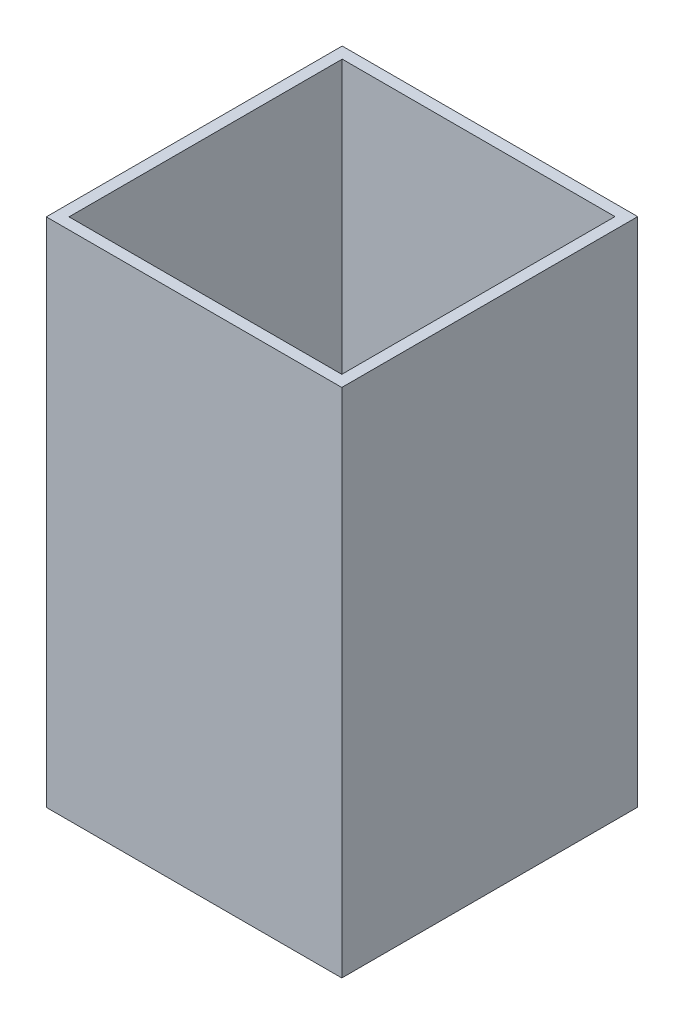
ISO-10303-21;
HEADER;
FILE_DESCRIPTION(('STEP AP214'),'2;1');
FILE_NAME('part.step','',(''),(''),'','','');
FILE_SCHEMA(('AUTOMOTIVE_DESIGN { 1 0 10303 214 1 1 1 1 }'));
ENDSEC;
DATA;
#1=APPLICATION_CONTEXT('core data for automotive mechanical design processes');
#2=APPLICATION_PROTOCOL_DEFINITION('international standard','automotive_design',2000,#1);
#3=PRODUCT_CONTEXT('',#1,'mechanical');
#4=PRODUCT('Part','Part','',(#3));
#5=PRODUCT_RELATED_PRODUCT_CATEGORY('part','',(#4));
#6=PRODUCT_DEFINITION_FORMATION('','',#4);
#7=PRODUCT_DEFINITION_CONTEXT('part definition',#1,'design');
#8=PRODUCT_DEFINITION('design','',#6,#7);
#9=PRODUCT_DEFINITION_SHAPE('','',#8);
#10=(LENGTH_UNIT() NAMED_UNIT(*) SI_UNIT(.MILLI.,.METRE.));
#11=(NAMED_UNIT(*) PLANE_ANGLE_UNIT() SI_UNIT($,.RADIAN.));
#12=(NAMED_UNIT(*) SI_UNIT($,.STERADIAN.) SOLID_ANGLE_UNIT());
#13=UNCERTAINTY_MEASURE_WITH_UNIT(LENGTH_MEASURE(1.E-05),#10,'distance_accuracy_value','');
#14=(GEOMETRIC_REPRESENTATION_CONTEXT(3) GLOBAL_UNCERTAINTY_ASSIGNED_CONTEXT((#13)) GLOBAL_UNIT_ASSIGNED_CONTEXT((#10,
#11,#12)) REPRESENTATION_CONTEXT('',''));
#15=CARTESIAN_POINT('',(0.,0.,0.));
#16=DIRECTION('',(0.,0.,1.));
#17=DIRECTION('',(1.,0.,0.));
#18=AXIS2_PLACEMENT_3D('',#15,#16,#17);
#19=CARTESIAN_POINT('',(-130.,225.,130.18));
#20=DIRECTION('',(1.,0.,0.));
#21=DIRECTION('',(0.,0.,-1.));
#22=AXIS2_PLACEMENT_3D('',#19,#20,#21);
#23=PLANE('',#22);
#24=DIRECTION('',(0.,-1.,0.));
#25=VECTOR('',#24,1.);
#26=CARTESIAN_POINT('',(-130.,225.,-130.18));
#27=LINE('',#26,#25);
#28=CARTESIAN_POINT('',(-130.,225.,-130.18));
#29=VERTEX_POINT('',#28);
#30=CARTESIAN_POINT('',(-130.,-225.,-130.18));
#31=VERTEX_POINT('',#30);
#32=EDGE_CURVE('E120',#29,#31,#27,.T.);
#33=ORIENTED_EDGE('',*,*,#32,.T.);
#34=DIRECTION('',(0.,0.,-1.));
#35=VECTOR('',#34,1.);
#36=CARTESIAN_POINT('',(-130.,-225.,130.18));
#37=LINE('',#36,#35);
#38=CARTESIAN_POINT('',(-130.,-225.,130.18));
#39=VERTEX_POINT('',#38);
#40=EDGE_CURVE('E11',#39,#31,#37,.T.);
#41=ORIENTED_EDGE('',*,*,#40,.F.);
#42=DIRECTION('',(0.,-1.,0.));
#43=VECTOR('',#42,1.);
#44=CARTESIAN_POINT('',(-130.,225.,130.18));
#45=LINE('',#44,#43);
#46=CARTESIAN_POINT('',(-130.,225.,130.18));
#47=VERTEX_POINT('',#46);
#48=EDGE_CURVE('E152',#47,#39,#45,.T.);
#49=ORIENTED_EDGE('',*,*,#48,.F.);
#50=DIRECTION('',(0.,0.,-1.));
#51=VECTOR('',#50,1.);
#52=CARTESIAN_POINT('',(-130.,225.,130.18));
#53=LINE('',#52,#51);
#54=EDGE_CURVE('E166',#47,#29,#53,.T.);
#55=ORIENTED_EDGE('',*,*,#54,.T.);
#56=EDGE_LOOP('',(#33,#41,#49,#55));
#57=FACE_BOUND('',#56,.T.);
#58=ADVANCED_FACE('F39',(#57),#23,.F.);
#59=CARTESIAN_POINT('',(-130.,-225.,130.18));
#60=DIRECTION('',(0.,1.,0.));
#61=DIRECTION('',(0.,0.,1.));
#62=AXIS2_PLACEMENT_3D('',#59,#60,#61);
#63=PLANE('',#62);
#64=DIRECTION('',(1.,0.,0.));
#65=VECTOR('',#64,1.);
#66=CARTESIAN_POINT('',(-120.,-225.,-120.18));
#67=LINE('',#66,#65);
#68=CARTESIAN_POINT('',(-120.,-225.,-120.18));
#69=VERTEX_POINT('',#68);
#70=CARTESIAN_POINT('',(120.,-225.,-120.18));
#71=VERTEX_POINT('',#70);
#72=EDGE_CURVE('E126',#69,#71,#67,.T.);
#73=ORIENTED_EDGE('',*,*,#72,.F.);
#74=DIRECTION('',(0.,0.,-1.));
#75=VECTOR('',#74,1.);
#76=CARTESIAN_POINT('',(-120.,-225.,-120.18));
#77=LINE('',#76,#75);
#78=CARTESIAN_POINT('',(-120.,-225.,120.18));
#79=VERTEX_POINT('',#78);
#80=EDGE_CURVE('E106',#79,#69,#77,.T.);
#81=ORIENTED_EDGE('',*,*,#80,.F.);
#82=DIRECTION('',(-1.,0.,0.));
#83=VECTOR('',#82,1.);
#84=CARTESIAN_POINT('',(-120.,-225.,120.18));
#85=LINE('',#84,#83);
#86=CARTESIAN_POINT('',(120.,-225.,120.18));
#87=VERTEX_POINT('',#86);
#88=EDGE_CURVE('E116',#87,#79,#85,.T.);
#89=ORIENTED_EDGE('',*,*,#88,.F.);
#90=DIRECTION('',(0.,0.,1.));
#91=VECTOR('',#90,1.);
#92=CARTESIAN_POINT('',(120.,-225.,-120.18));
#93=LINE('',#92,#91);
#94=EDGE_CURVE('E54',#71,#87,#93,.T.);
#95=ORIENTED_EDGE('',*,*,#94,.F.);
#96=EDGE_LOOP('',(#73,#81,#89,#95));
#97=FACE_BOUND('',#96,.T.);
#98=DIRECTION('',(1.,0.,0.));
#99=VECTOR('',#98,1.);
#100=CARTESIAN_POINT('',(-130.,-225.,-130.18));
#101=LINE('',#100,#99);
#102=CARTESIAN_POINT('',(130.,-225.,-130.18));
#103=VERTEX_POINT('',#102);
#104=EDGE_CURVE('E170',#31,#103,#101,.T.);
#105=ORIENTED_EDGE('',*,*,#104,.T.);
#106=DIRECTION('',(0.,0.,-1.));
#107=VECTOR('',#106,1.);
#108=CARTESIAN_POINT('',(130.,-225.,130.18));
#109=LINE('',#108,#107);
#110=CARTESIAN_POINT('',(130.,-225.,130.18));
#111=VERTEX_POINT('',#110);
#112=EDGE_CURVE('E47',#111,#103,#109,.T.);
#113=ORIENTED_EDGE('',*,*,#112,.F.);
#114=DIRECTION('',(1.,0.,0.));
#115=VECTOR('',#114,1.);
#116=CARTESIAN_POINT('',(-130.,-225.,130.18));
#117=LINE('',#116,#115);
#118=EDGE_CURVE('E156',#39,#111,#117,.T.);
#119=ORIENTED_EDGE('',*,*,#118,.F.);
#120=ORIENTED_EDGE('',*,*,#40,.T.);
#121=EDGE_LOOP('',(#105,#113,#119,#120));
#122=FACE_BOUND('',#121,.T.);
#123=ADVANCED_FACE('F123',(#97,#122),#63,.F.);
#124=CARTESIAN_POINT('',(130.,225.,130.18));
#125=DIRECTION('',(-1.,0.,0.));
#126=DIRECTION('',(0.,0.,1.));
#127=AXIS2_PLACEMENT_3D('',#124,#125,#126);
#128=PLANE('',#127);
#129=DIRECTION('',(0.,1.,0.));
#130=VECTOR('',#129,1.);
#131=CARTESIAN_POINT('',(130.,225.,-130.18));
#132=LINE('',#131,#130);
#133=CARTESIAN_POINT('',(130.,225.,-130.18));
#134=VERTEX_POINT('',#133);
#135=EDGE_CURVE('E173',#103,#134,#132,.T.);
#136=ORIENTED_EDGE('',*,*,#135,.T.);
#137=DIRECTION('',(0.,0.,-1.));
#138=VECTOR('',#137,1.);
#139=CARTESIAN_POINT('',(130.,225.,130.18));
#140=LINE('',#139,#138);
#141=CARTESIAN_POINT('',(130.,225.,130.18));
#142=VERTEX_POINT('',#141);
#143=EDGE_CURVE('E181',#142,#134,#140,.T.);
#144=ORIENTED_EDGE('',*,*,#143,.F.);
#145=DIRECTION('',(0.,1.,0.));
#146=VECTOR('',#145,1.);
#147=CARTESIAN_POINT('',(130.,225.,130.18));
#148=LINE('',#147,#146);
#149=EDGE_CURVE('E160',#111,#142,#148,.T.);
#150=ORIENTED_EDGE('',*,*,#149,.F.);
#151=ORIENTED_EDGE('',*,*,#112,.T.);
#152=EDGE_LOOP('',(#136,#144,#150,#151));
#153=FACE_BOUND('',#152,.T.);
#154=ADVANCED_FACE('F190',(#153),#128,.F.);
#155=CARTESIAN_POINT('',(-130.,225.,130.18));
#156=DIRECTION('',(0.,-1.,0.));
#157=DIRECTION('',(0.,0.,-1.));
#158=AXIS2_PLACEMENT_3D('',#155,#156,#157);
#159=PLANE('',#158);
#160=DIRECTION('',(1.,0.,0.));
#161=VECTOR('',#160,1.);
#162=CARTESIAN_POINT('',(-120.,225.,120.18));
#163=LINE('',#162,#161);
#164=CARTESIAN_POINT('',(-120.,225.,120.18));
#165=VERTEX_POINT('',#164);
#166=CARTESIAN_POINT('',(120.,225.,120.18));
#167=VERTEX_POINT('',#166);
#168=EDGE_CURVE('E131',#165,#167,#163,.T.);
#169=ORIENTED_EDGE('',*,*,#168,.F.);
#170=DIRECTION('',(0.,0.,1.));
#171=VECTOR('',#170,1.);
#172=CARTESIAN_POINT('',(-120.,225.,-120.18));
#173=LINE('',#172,#171);
#174=CARTESIAN_POINT('',(-120.,225.,-120.18));
#175=VERTEX_POINT('',#174);
#176=EDGE_CURVE('E62',#175,#165,#173,.T.);
#177=ORIENTED_EDGE('',*,*,#176,.F.);
#178=DIRECTION('',(-1.,0.,0.));
#179=VECTOR('',#178,1.);
#180=CARTESIAN_POINT('',(-120.,225.,-120.18));
#181=LINE('',#180,#179);
#182=CARTESIAN_POINT('',(120.,225.,-120.18));
#183=VERTEX_POINT('',#182);
#184=EDGE_CURVE('E113',#183,#175,#181,.T.);
#185=ORIENTED_EDGE('',*,*,#184,.F.);
#186=DIRECTION('',(0.,0.,-1.));
#187=VECTOR('',#186,1.);
#188=CARTESIAN_POINT('',(120.,225.,-120.18));
#189=LINE('',#188,#187);
#190=EDGE_CURVE('E138',#167,#183,#189,.T.);
#191=ORIENTED_EDGE('',*,*,#190,.F.);
#192=EDGE_LOOP('',(#169,#177,#185,#191));
#193=FACE_BOUND('',#192,.T.);
#194=DIRECTION('',(-1.,0.,0.));
#195=VECTOR('',#194,1.);
#196=CARTESIAN_POINT('',(-130.,225.,-130.18));
#197=LINE('',#196,#195);
#198=EDGE_CURVE('E157',#134,#29,#197,.T.);
#199=ORIENTED_EDGE('',*,*,#198,.T.);
#200=ORIENTED_EDGE('',*,*,#54,.F.);
#201=DIRECTION('',(-1.,0.,0.));
#202=VECTOR('',#201,1.);
#203=CARTESIAN_POINT('',(-130.,225.,130.18));
#204=LINE('',#203,#202);
#205=EDGE_CURVE('E163',#142,#47,#204,.T.);
#206=ORIENTED_EDGE('',*,*,#205,.F.);
#207=ORIENTED_EDGE('',*,*,#143,.T.);
#208=EDGE_LOOP('',(#199,#200,#206,#207));
#209=FACE_BOUND('',#208,.T.);
#210=ADVANCED_FACE('F198',(#193,#209),#159,.F.);
#211=CARTESIAN_POINT('',(0.,0.,130.18));
#212=DIRECTION('',(0.,0.,1.));
#213=DIRECTION('',(1.,0.,0.));
#214=AXIS2_PLACEMENT_3D('',#211,#212,#213);
#215=PLANE('',#214);
#216=ORIENTED_EDGE('',*,*,#48,.T.);
#217=ORIENTED_EDGE('',*,*,#118,.T.);
#218=ORIENTED_EDGE('',*,*,#149,.T.);
#219=ORIENTED_EDGE('',*,*,#205,.T.);
#220=EDGE_LOOP('',(#216,#217,#218,#219));
#221=FACE_BOUND('',#220,.T.);
#222=ADVANCED_FACE('F204',(#221),#215,.T.);
#223=CARTESIAN_POINT('',(0.,0.,-130.18));
#224=DIRECTION('',(0.,0.,1.));
#225=DIRECTION('',(1.,0.,0.));
#226=AXIS2_PLACEMENT_3D('',#223,#224,#225);
#227=PLANE('',#226);
#228=ORIENTED_EDGE('',*,*,#32,.F.);
#229=ORIENTED_EDGE('',*,*,#198,.F.);
#230=ORIENTED_EDGE('',*,*,#135,.F.);
#231=ORIENTED_EDGE('',*,*,#104,.F.);
#232=EDGE_LOOP('',(#228,#229,#230,#231));
#233=FACE_BOUND('',#232,.T.);
#234=ADVANCED_FACE('F195',(#233),#227,.F.);
#235=CARTESIAN_POINT('',(-120.,-225.001,-120.18));
#236=DIRECTION('',(-1.,0.,0.));
#237=DIRECTION('',(0.,0.,1.));
#238=AXIS2_PLACEMENT_3D('',#235,#236,#237);
#239=PLANE('',#238);
#240=ORIENTED_EDGE('',*,*,#80,.T.);
#241=DIRECTION('',(0.,1.,0.));
#242=VECTOR('',#241,1.);
#243=CARTESIAN_POINT('',(-120.,-225.001,-120.18));
#244=LINE('',#243,#242);
#245=EDGE_CURVE('E121',#69,#175,#244,.T.);
#246=ORIENTED_EDGE('',*,*,#245,.T.);
#247=ORIENTED_EDGE('',*,*,#176,.T.);
#248=DIRECTION('',(0.,1.,0.));
#249=VECTOR('',#248,1.);
#250=CARTESIAN_POINT('',(-120.,-225.001,120.18));
#251=LINE('',#250,#249);
#252=EDGE_CURVE('E102',#79,#165,#251,.T.);
#253=ORIENTED_EDGE('',*,*,#252,.F.);
#254=EDGE_LOOP('',(#240,#246,#247,#253));
#255=FACE_BOUND('',#254,.T.);
#256=ADVANCED_FACE('F104',(#255),#239,.F.);
#257=CARTESIAN_POINT('',(-120.,-225.001,-120.18));
#258=DIRECTION('',(0.,0.,-1.));
#259=DIRECTION('',(-1.,0.,0.));
#260=AXIS2_PLACEMENT_3D('',#257,#258,#259);
#261=PLANE('',#260);
#262=ORIENTED_EDGE('',*,*,#72,.T.);
#263=DIRECTION('',(0.,1.,0.));
#264=VECTOR('',#263,1.);
#265=CARTESIAN_POINT('',(120.,-225.001,-120.18));
#266=LINE('',#265,#264);
#267=EDGE_CURVE('E147',#71,#183,#266,.T.);
#268=ORIENTED_EDGE('',*,*,#267,.T.);
#269=ORIENTED_EDGE('',*,*,#184,.T.);
#270=ORIENTED_EDGE('',*,*,#245,.F.);
#271=EDGE_LOOP('',(#262,#268,#269,#270));
#272=FACE_BOUND('',#271,.T.);
#273=ADVANCED_FACE('F221',(#272),#261,.F.);
#274=CARTESIAN_POINT('',(120.,-225.001,-120.18));
#275=DIRECTION('',(1.,0.,0.));
#276=DIRECTION('',(0.,0.,-1.));
#277=AXIS2_PLACEMENT_3D('',#274,#275,#276);
#278=PLANE('',#277);
#279=ORIENTED_EDGE('',*,*,#94,.T.);
#280=DIRECTION('',(0.,1.,0.));
#281=VECTOR('',#280,1.);
#282=CARTESIAN_POINT('',(120.,-225.001,120.18));
#283=LINE('',#282,#281);
#284=EDGE_CURVE('E112',#87,#167,#283,.T.);
#285=ORIENTED_EDGE('',*,*,#284,.T.);
#286=ORIENTED_EDGE('',*,*,#190,.T.);
#287=ORIENTED_EDGE('',*,*,#267,.F.);
#288=EDGE_LOOP('',(#279,#285,#286,#287));
#289=FACE_BOUND('',#288,.T.);
#290=ADVANCED_FACE('F224',(#289),#278,.F.);
#291=CARTESIAN_POINT('',(-120.,-225.001,120.18));
#292=DIRECTION('',(0.,0.,1.));
#293=DIRECTION('',(1.,0.,0.));
#294=AXIS2_PLACEMENT_3D('',#291,#292,#293);
#295=PLANE('',#294);
#296=ORIENTED_EDGE('',*,*,#88,.T.);
#297=ORIENTED_EDGE('',*,*,#252,.T.);
#298=ORIENTED_EDGE('',*,*,#168,.T.);
#299=ORIENTED_EDGE('',*,*,#284,.F.);
#300=EDGE_LOOP('',(#296,#297,#298,#299));
#301=FACE_BOUND('',#300,.T.);
#302=ADVANCED_FACE('F117',(#301),#295,.F.);
#303=CLOSED_SHELL('',(#58,#123,#154,#210,#222,#234,#256,#273,#290,#302));
#304=MANIFOLD_SOLID_BREP('B2',#303);
#305=ADVANCED_BREP_SHAPE_REPRESENTATION('',(#18,#304),#14);
#306=SHAPE_DEFINITION_REPRESENTATION(#9,#305);
ENDSEC;
END-ISO-10303-21;
